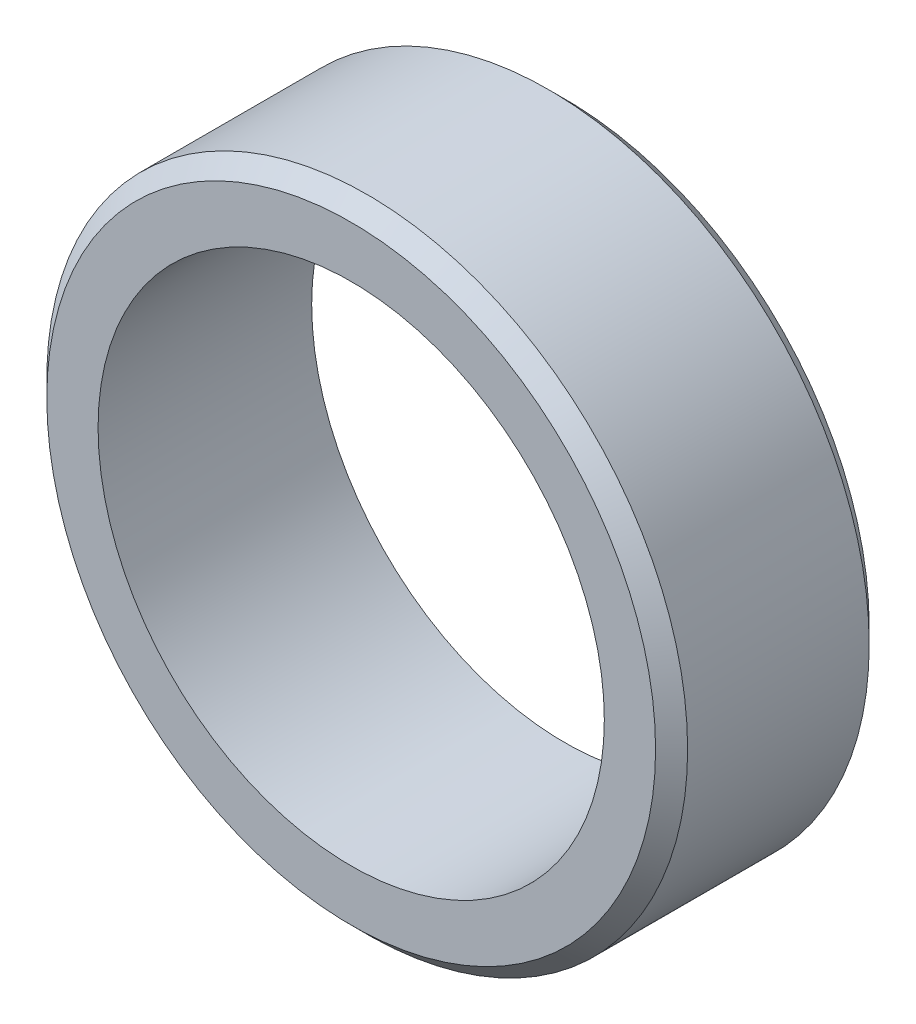
ISO-10303-21;
HEADER;
FILE_DESCRIPTION(('STEP AP214'),'2;1');
FILE_NAME('part.step','',(''),(''),'','','');
FILE_SCHEMA(('AUTOMOTIVE_DESIGN { 1 0 10303 214 1 1 1 1 }'));
ENDSEC;
DATA;
#1=APPLICATION_CONTEXT('core data for automotive mechanical design processes');
#2=APPLICATION_PROTOCOL_DEFINITION('international standard','automotive_design',2000,#1);
#3=PRODUCT_CONTEXT('',#1,'mechanical');
#4=PRODUCT('Part','Part','',(#3));
#5=PRODUCT_RELATED_PRODUCT_CATEGORY('part','',(#4));
#6=PRODUCT_DEFINITION_FORMATION('','',#4);
#7=PRODUCT_DEFINITION_CONTEXT('part definition',#1,'design');
#8=PRODUCT_DEFINITION('design','',#6,#7);
#9=PRODUCT_DEFINITION_SHAPE('','',#8);
#10=(LENGTH_UNIT() NAMED_UNIT(*) SI_UNIT(.MILLI.,.METRE.));
#11=(NAMED_UNIT(*) PLANE_ANGLE_UNIT() SI_UNIT($,.RADIAN.));
#12=(NAMED_UNIT(*) SI_UNIT($,.STERADIAN.) SOLID_ANGLE_UNIT());
#13=UNCERTAINTY_MEASURE_WITH_UNIT(LENGTH_MEASURE(1.E-05),#10,'distance_accuracy_value','');
#14=(GEOMETRIC_REPRESENTATION_CONTEXT(3) GLOBAL_UNCERTAINTY_ASSIGNED_CONTEXT((#13)) GLOBAL_UNIT_ASSIGNED_CONTEXT((#10,
#11,#12)) REPRESENTATION_CONTEXT('',''));
#15=CARTESIAN_POINT('',(0.,0.,0.));
#16=DIRECTION('',(0.,0.,1.));
#17=DIRECTION('',(1.,0.,0.));
#18=AXIS2_PLACEMENT_3D('',#15,#16,#17);
#19=CARTESIAN_POINT('',(0.,0.,-7.9375));
#20=DIRECTION('',(0.,0.,1.));
#21=DIRECTION('',(1.,0.,0.));
#22=AXIS2_PLACEMENT_3D('',#19,#20,#21);
#23=CYLINDRICAL_SURFACE('',#22,19.05);
#24=CARTESIAN_POINT('',(0.,0.,3.81));
#25=DIRECTION('',(0.,0.,1.));
#26=DIRECTION('',(1.,0.,0.));
#27=AXIS2_PLACEMENT_3D('',#24,#25,#26);
#28=CIRCLE('',#27,19.05);
#29=CARTESIAN_POINT('',(19.05,0.,3.81));
#30=VERTEX_POINT('',#29);
#31=EDGE_CURVE('E51',#30,#30,#28,.F.);
#32=ORIENTED_EDGE('',*,*,#31,.T.);
#33=EDGE_LOOP('',(#32));
#34=FACE_BOUND('',#33,.T.);
#35=CARTESIAN_POINT('',(0.,0.,-6.98500000000001));
#36=DIRECTION('',(0.,0.,1.));
#37=DIRECTION('',(1.,0.,0.));
#38=AXIS2_PLACEMENT_3D('',#35,#36,#37);
#39=CIRCLE('',#38,19.05);
#40=CARTESIAN_POINT('',(19.05,0.,-6.98500000000001));
#41=VERTEX_POINT('',#40);
#42=EDGE_CURVE('E63',#41,#41,#39,.T.);
#43=ORIENTED_EDGE('',*,*,#42,.T.);
#44=EDGE_LOOP('',(#43));
#45=FACE_BOUND('',#44,.T.);
#46=ADVANCED_FACE('F42',(#34,#45),#23,.T.);
#47=CARTESIAN_POINT('',(0.,0.,-7.9375));
#48=DIRECTION('',(0.,0.,1.));
#49=DIRECTION('',(1.,0.,0.));
#50=AXIS2_PLACEMENT_3D('',#47,#48,#49);
#51=PLANE('',#50);
#52=CARTESIAN_POINT('',(0.,0.,-7.9375));
#53=DIRECTION('',(0.,0.,1.));
#54=DIRECTION('',(1.,0.,0.));
#55=AXIS2_PLACEMENT_3D('',#52,#53,#54);
#56=CIRCLE('',#55,15.0495);
#57=CARTESIAN_POINT('',(15.0495,0.,-7.9375));
#58=VERTEX_POINT('',#57);
#59=EDGE_CURVE('E69',#58,#58,#56,.T.);
#60=ORIENTED_EDGE('',*,*,#59,.T.);
#61=EDGE_LOOP('',(#60));
#62=FACE_BOUND('',#61,.T.);
#63=CARTESIAN_POINT('',(0.,0.,-7.9375));
#64=DIRECTION('',(0.,0.,1.));
#65=DIRECTION('',(1.,0.,0.));
#66=AXIS2_PLACEMENT_3D('',#63,#64,#65);
#67=CIRCLE('',#66,18.0975);
#68=CARTESIAN_POINT('',(18.0975,0.,-7.9375));
#69=VERTEX_POINT('',#68);
#70=EDGE_CURVE('E57',#69,#69,#67,.F.);
#71=ORIENTED_EDGE('',*,*,#70,.T.);
#72=EDGE_LOOP('',(#71));
#73=FACE_BOUND('',#72,.T.);
#74=ADVANCED_FACE('F79',(#62,#73),#51,.F.);
#75=CARTESIAN_POINT('',(0.,0.,-6.98500000000001));
#76=DIRECTION('',(0.,0.,1.));
#77=DIRECTION('',(1.,0.,0.));
#78=AXIS2_PLACEMENT_3D('',#75,#76,#77);
#79=CONICAL_SURFACE('',#78,19.05,0.785398163397454);
#80=ORIENTED_EDGE('',*,*,#70,.F.);
#81=EDGE_LOOP('',(#80));
#82=FACE_BOUND('',#81,.T.);
#83=ORIENTED_EDGE('',*,*,#42,.F.);
#84=EDGE_LOOP('',(#83));
#85=FACE_BOUND('',#84,.T.);
#86=ADVANCED_FACE('F90',(#82,#85),#79,.T.);
#87=CARTESIAN_POINT('',(0.,0.,4.7625));
#88=DIRECTION('',(0.,0.,1.));
#89=DIRECTION('',(1.,0.,0.));
#90=AXIS2_PLACEMENT_3D('',#87,#88,#89);
#91=PLANE('',#90);
#92=CARTESIAN_POINT('',(0.,0.,4.7625));
#93=DIRECTION('',(0.,0.,1.));
#94=DIRECTION('',(1.,0.,0.));
#95=AXIS2_PLACEMENT_3D('',#92,#93,#94);
#96=CIRCLE('',#95,18.0975);
#97=CARTESIAN_POINT('',(18.0975,0.,4.7625));
#98=VERTEX_POINT('',#97);
#99=EDGE_CURVE('E11',#98,#98,#96,.T.);
#100=ORIENTED_EDGE('',*,*,#99,.T.);
#101=EDGE_LOOP('',(#100));
#102=FACE_BOUND('',#101,.T.);
#103=CARTESIAN_POINT('',(0.,0.,4.7625));
#104=DIRECTION('',(0.,0.,1.));
#105=DIRECTION('',(1.,0.,0.));
#106=AXIS2_PLACEMENT_3D('',#103,#104,#105);
#107=CIRCLE('',#106,15.0495);
#108=CARTESIAN_POINT('',(15.0495,0.,4.7625));
#109=VERTEX_POINT('',#108);
#110=EDGE_CURVE('E70',#109,#109,#107,.T.);
#111=ORIENTED_EDGE('',*,*,#110,.F.);
#112=EDGE_LOOP('',(#111));
#113=FACE_BOUND('',#112,.T.);
#114=ADVANCED_FACE('F85',(#102,#113),#91,.T.);
#115=CARTESIAN_POINT('',(0.,0.,-7.9375));
#116=DIRECTION('',(0.,0.,1.));
#117=DIRECTION('',(1.,0.,0.));
#118=AXIS2_PLACEMENT_3D('',#115,#116,#117);
#119=CYLINDRICAL_SURFACE('',#118,15.0495);
#120=ORIENTED_EDGE('',*,*,#59,.F.);
#121=EDGE_LOOP('',(#120));
#122=FACE_BOUND('',#121,.T.);
#123=ORIENTED_EDGE('',*,*,#110,.T.);
#124=EDGE_LOOP('',(#123));
#125=FACE_BOUND('',#124,.T.);
#126=ADVANCED_FACE('F82',(#122,#125),#119,.F.);
#127=CARTESIAN_POINT('',(0.,0.,3.81));
#128=DIRECTION('',(0.,0.,-1.));
#129=DIRECTION('',(-1.,0.,0.));
#130=AXIS2_PLACEMENT_3D('',#127,#128,#129);
#131=CONICAL_SURFACE('',#130,19.05,0.785398163397452);
#132=ORIENTED_EDGE('',*,*,#99,.F.);
#133=EDGE_LOOP('',(#132));
#134=FACE_BOUND('',#133,.T.);
#135=ORIENTED_EDGE('',*,*,#31,.F.);
#136=EDGE_LOOP('',(#135));
#137=FACE_BOUND('',#136,.T.);
#138=ADVANCED_FACE('F45',(#134,#137),#131,.T.);
#139=CLOSED_SHELL('',(#46,#74,#86,#114,#126,#138));
#140=MANIFOLD_SOLID_BREP('B2',#139);
#141=ADVANCED_BREP_SHAPE_REPRESENTATION('',(#18,#140),#14);
#142=SHAPE_DEFINITION_REPRESENTATION(#9,#141);
ENDSEC;
END-ISO-10303-21;
